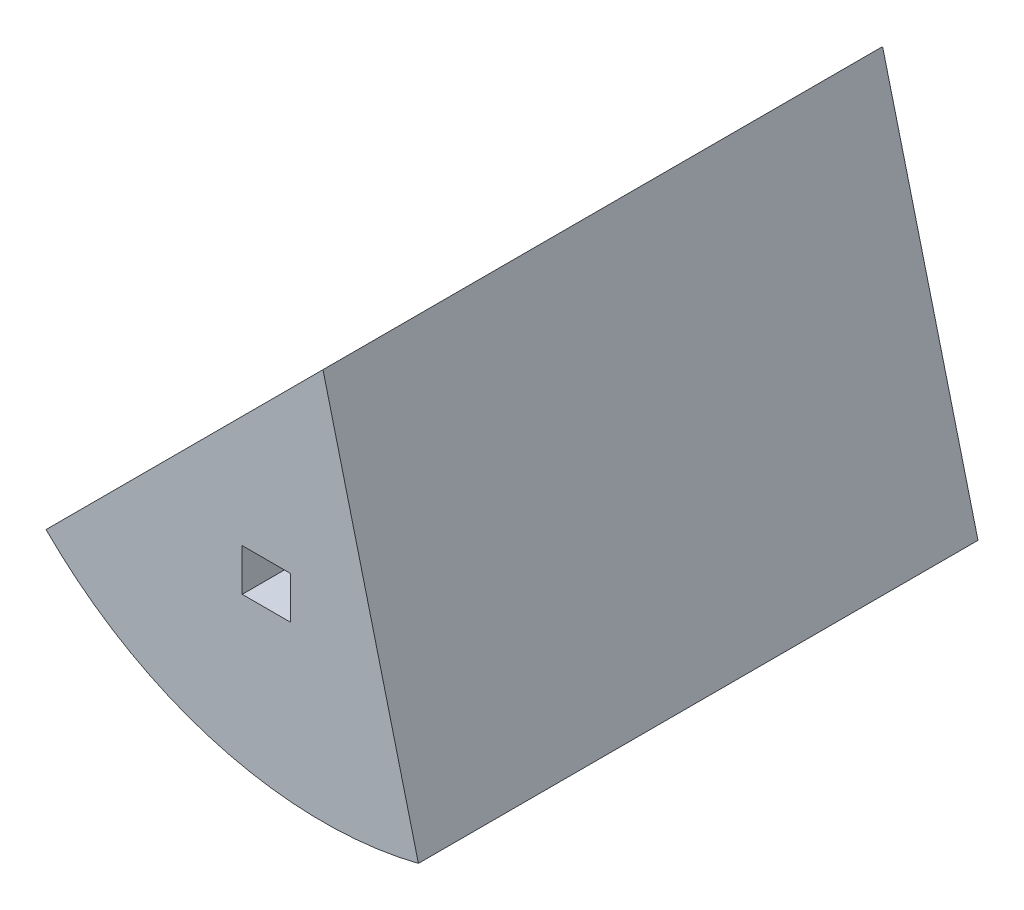
ISO-10303-21;
HEADER;
FILE_DESCRIPTION(('STEP AP214'),'2;1');
FILE_NAME('part.step','',(''),(''),'','','');
FILE_SCHEMA(('AUTOMOTIVE_DESIGN { 1 0 10303 214 1 1 1 1 }'));
ENDSEC;
DATA;
#1=APPLICATION_CONTEXT('core data for automotive mechanical design processes');
#2=APPLICATION_PROTOCOL_DEFINITION('international standard','automotive_design',2000,#1);
#3=PRODUCT_CONTEXT('',#1,'mechanical');
#4=PRODUCT('Part','Part','',(#3));
#5=PRODUCT_RELATED_PRODUCT_CATEGORY('part','',(#4));
#6=PRODUCT_DEFINITION_FORMATION('','',#4);
#7=PRODUCT_DEFINITION_CONTEXT('part definition',#1,'design');
#8=PRODUCT_DEFINITION('design','',#6,#7);
#9=PRODUCT_DEFINITION_SHAPE('','',#8);
#10=(LENGTH_UNIT() NAMED_UNIT(*) SI_UNIT(.MILLI.,.METRE.));
#11=(NAMED_UNIT(*) PLANE_ANGLE_UNIT() SI_UNIT($,.RADIAN.));
#12=(NAMED_UNIT(*) SI_UNIT($,.STERADIAN.) SOLID_ANGLE_UNIT());
#13=UNCERTAINTY_MEASURE_WITH_UNIT(LENGTH_MEASURE(1.E-05),#10,'distance_accuracy_value','');
#14=(GEOMETRIC_REPRESENTATION_CONTEXT(3) GLOBAL_UNCERTAINTY_ASSIGNED_CONTEXT((#13)) GLOBAL_UNIT_ASSIGNED_CONTEXT((#10,
#11,#12)) REPRESENTATION_CONTEXT('',''));
#15=CARTESIAN_POINT('',(0.,0.,0.));
#16=DIRECTION('',(0.,0.,1.));
#17=DIRECTION('',(1.,0.,0.));
#18=AXIS2_PLACEMENT_3D('',#15,#16,#17);
#19=CARTESIAN_POINT('',(0.,0.,50.));
#20=DIRECTION('',(0.,0.,1.));
#21=DIRECTION('',(1.,0.,0.));
#22=AXIS2_PLACEMENT_3D('',#19,#20,#21);
#23=PLANE('',#22);
#24=DIRECTION('',(0.,1.,0.));
#25=VECTOR('',#24,1.);
#26=CARTESIAN_POINT('',(-2.89211557890212,-20.9937215315126,50.));
#27=LINE('',#26,#25);
#28=CARTESIAN_POINT('',(-2.89211557890212,-20.9937215315126,50.));
#29=VERTEX_POINT('',#28);
#30=CARTESIAN_POINT('',(-2.89211557890212,-17.2235406813055,50.));
#31=VERTEX_POINT('',#30);
#32=EDGE_CURVE('E48',#29,#31,#27,.T.);
#33=ORIENTED_EDGE('',*,*,#32,.F.);
#34=DIRECTION('',(1.,0.,0.));
#35=VECTOR('',#34,1.);
#36=CARTESIAN_POINT('',(-7.21647723685237,-20.9937215315126,50.));
#37=LINE('',#36,#35);
#38=CARTESIAN_POINT('',(-7.21647723685237,-20.9937215315126,50.));
#39=VERTEX_POINT('',#38);
#40=EDGE_CURVE('E110',#39,#29,#37,.T.);
#41=ORIENTED_EDGE('',*,*,#40,.F.);
#42=DIRECTION('',(0.,-1.,0.));
#43=VECTOR('',#42,1.);
#44=CARTESIAN_POINT('',(-7.21647723685237,-20.9937215315126,50.));
#45=LINE('',#44,#43);
#46=CARTESIAN_POINT('',(-7.21647723685237,-17.2235406813055,50.));
#47=VERTEX_POINT('',#46);
#48=EDGE_CURVE('E113',#47,#39,#45,.T.);
#49=ORIENTED_EDGE('',*,*,#48,.F.);
#50=DIRECTION('',(-1.,0.,0.));
#51=VECTOR('',#50,1.);
#52=CARTESIAN_POINT('',(-7.21647723685237,-17.2235406813055,50.));
#53=LINE('',#52,#51);
#54=EDGE_CURVE('E119',#31,#47,#53,.T.);
#55=ORIENTED_EDGE('',*,*,#54,.F.);
#56=EDGE_LOOP('',(#33,#41,#49,#55));
#57=FACE_BOUND('',#56,.T.);
#58=DIRECTION('',(-0.243558846598436,0.969886121275915,0.));
#59=VECTOR('',#58,1.);
#60=CARTESIAN_POINT('',(0.,0.,50.));
#61=LINE('',#60,#59);
#62=CARTESIAN_POINT('',(8.52455963094525,-33.946014244657,50.));
#63=VERTEX_POINT('',#62);
#64=CARTESIAN_POINT('',(0.,0.,50.));
#65=VERTEX_POINT('',#64);
#66=EDGE_CURVE('E129',#63,#65,#61,.T.);
#67=ORIENTED_EDGE('',*,*,#66,.T.);
#68=DIRECTION('',(-0.707106781186548,-0.707106781186548,0.));
#69=VECTOR('',#68,1.);
#70=CARTESIAN_POINT('',(0.,0.,50.));
#71=LINE('',#70,#69);
#72=CARTESIAN_POINT('',(-24.7487373415292,-24.7487373415292,50.));
#73=VERTEX_POINT('',#72);
#74=EDGE_CURVE('E132',#65,#73,#71,.T.);
#75=ORIENTED_EDGE('',*,*,#74,.T.);
#76=CARTESIAN_POINT('',(0.,0.,50.));
#77=DIRECTION('',(0.,0.,1.));
#78=DIRECTION('',(1.,0.,0.));
#79=AXIS2_PLACEMENT_3D('',#76,#77,#78);
#80=CIRCLE('',#79,35.);
#81=EDGE_CURVE('E135',#73,#63,#80,.T.);
#82=ORIENTED_EDGE('',*,*,#81,.T.);
#83=EDGE_LOOP('',(#67,#75,#82));
#84=FACE_BOUND('',#83,.T.);
#85=ADVANCED_FACE('F33',(#57,#84),#23,.T.);
#86=CARTESIAN_POINT('',(0.,0.,0.));
#87=DIRECTION('',(0.,0.,1.));
#88=DIRECTION('',(1.,0.,0.));
#89=AXIS2_PLACEMENT_3D('',#86,#87,#88);
#90=PLANE('',#89);
#91=DIRECTION('',(1.,0.,0.));
#92=VECTOR('',#91,1.);
#93=CARTESIAN_POINT('',(-7.21647723685237,-20.9937215315126,0.));
#94=LINE('',#93,#92);
#95=CARTESIAN_POINT('',(-7.21647723685237,-20.9937215315126,0.));
#96=VERTEX_POINT('',#95);
#97=CARTESIAN_POINT('',(-2.89211557890212,-20.9937215315126,0.));
#98=VERTEX_POINT('',#97);
#99=EDGE_CURVE('E100',#96,#98,#94,.T.);
#100=ORIENTED_EDGE('',*,*,#99,.T.);
#101=DIRECTION('',(0.,1.,0.));
#102=VECTOR('',#101,1.);
#103=CARTESIAN_POINT('',(-2.89211557890212,-20.9937215315126,0.));
#104=LINE('',#103,#102);
#105=CARTESIAN_POINT('',(-2.89211557890212,-17.2235406813055,0.));
#106=VERTEX_POINT('',#105);
#107=EDGE_CURVE('E94',#98,#106,#104,.T.);
#108=ORIENTED_EDGE('',*,*,#107,.T.);
#109=DIRECTION('',(-1.,0.,0.));
#110=VECTOR('',#109,1.);
#111=CARTESIAN_POINT('',(-7.21647723685237,-17.2235406813055,0.));
#112=LINE('',#111,#110);
#113=CARTESIAN_POINT('',(-7.21647723685237,-17.2235406813055,0.));
#114=VERTEX_POINT('',#113);
#115=EDGE_CURVE('E103',#106,#114,#112,.T.);
#116=ORIENTED_EDGE('',*,*,#115,.T.);
#117=DIRECTION('',(0.,-1.,0.));
#118=VECTOR('',#117,1.);
#119=CARTESIAN_POINT('',(-7.21647723685237,-20.9937215315126,0.));
#120=LINE('',#119,#118);
#121=EDGE_CURVE('E56',#114,#96,#120,.T.);
#122=ORIENTED_EDGE('',*,*,#121,.T.);
#123=EDGE_LOOP('',(#100,#108,#116,#122));
#124=FACE_BOUND('',#123,.T.);
#125=DIRECTION('',(-0.243558846598436,0.969886121275915,0.));
#126=VECTOR('',#125,1.);
#127=CARTESIAN_POINT('',(0.,0.,0.));
#128=LINE('',#127,#126);
#129=CARTESIAN_POINT('',(8.52455963094525,-33.946014244657,0.));
#130=VERTEX_POINT('',#129);
#131=CARTESIAN_POINT('',(0.,0.,0.));
#132=VERTEX_POINT('',#131);
#133=EDGE_CURVE('E125',#130,#132,#128,.T.);
#134=ORIENTED_EDGE('',*,*,#133,.F.);
#135=CARTESIAN_POINT('',(0.,0.,0.));
#136=DIRECTION('',(0.,0.,1.));
#137=DIRECTION('',(1.,0.,0.));
#138=AXIS2_PLACEMENT_3D('',#135,#136,#137);
#139=CIRCLE('',#138,35.);
#140=CARTESIAN_POINT('',(-24.7487373415292,-24.7487373415292,0.));
#141=VERTEX_POINT('',#140);
#142=EDGE_CURVE('E133',#141,#130,#139,.T.);
#143=ORIENTED_EDGE('',*,*,#142,.F.);
#144=DIRECTION('',(-0.707106781186548,-0.707106781186548,0.));
#145=VECTOR('',#144,1.);
#146=CARTESIAN_POINT('',(0.,0.,0.));
#147=LINE('',#146,#145);
#148=EDGE_CURVE('E140',#132,#141,#147,.T.);
#149=ORIENTED_EDGE('',*,*,#148,.F.);
#150=EDGE_LOOP('',(#134,#143,#149));
#151=FACE_BOUND('',#150,.T.);
#152=ADVANCED_FACE('F107',(#124,#151),#90,.F.);
#153=CARTESIAN_POINT('',(0.,0.,50.));
#154=DIRECTION('',(-0.969886121275915,-0.243558846598436,0.));
#155=DIRECTION('',(0.243558846598436,-0.969886121275915,0.));
#156=AXIS2_PLACEMENT_3D('',#153,#154,#155);
#157=PLANE('',#156);
#158=ORIENTED_EDGE('',*,*,#133,.T.);
#159=DIRECTION('',(0.,0.,-1.));
#160=VECTOR('',#159,1.);
#161=CARTESIAN_POINT('',(0.,0.,50.));
#162=LINE('',#161,#160);
#163=EDGE_CURVE('E11',#65,#132,#162,.T.);
#164=ORIENTED_EDGE('',*,*,#163,.F.);
#165=ORIENTED_EDGE('',*,*,#66,.F.);
#166=DIRECTION('',(0.,0.,-1.));
#167=VECTOR('',#166,1.);
#168=CARTESIAN_POINT('',(8.52455963094525,-33.946014244657,50.));
#169=LINE('',#168,#167);
#170=EDGE_CURVE('E137',#63,#130,#169,.T.);
#171=ORIENTED_EDGE('',*,*,#170,.T.);
#172=EDGE_LOOP('',(#158,#164,#165,#171));
#173=FACE_BOUND('',#172,.T.);
#174=ADVANCED_FACE('F35',(#173),#157,.F.);
#175=CARTESIAN_POINT('',(0.,0.,50.));
#176=DIRECTION('',(0.707106781186548,-0.707106781186548,0.));
#177=DIRECTION('',(0.707106781186548,0.707106781186548,0.));
#178=AXIS2_PLACEMENT_3D('',#175,#176,#177);
#179=PLANE('',#178);
#180=ORIENTED_EDGE('',*,*,#148,.T.);
#181=DIRECTION('',(0.,0.,-1.));
#182=VECTOR('',#181,1.);
#183=CARTESIAN_POINT('',(-24.7487373415292,-24.7487373415292,50.));
#184=LINE('',#183,#182);
#185=EDGE_CURVE('E41',#73,#141,#184,.T.);
#186=ORIENTED_EDGE('',*,*,#185,.F.);
#187=ORIENTED_EDGE('',*,*,#74,.F.);
#188=ORIENTED_EDGE('',*,*,#163,.T.);
#189=EDGE_LOOP('',(#180,#186,#187,#188));
#190=FACE_BOUND('',#189,.T.);
#191=ADVANCED_FACE('F157',(#190),#179,.F.);
#192=CARTESIAN_POINT('',(0.,0.,50.));
#193=DIRECTION('',(0.,0.,-1.));
#194=DIRECTION('',(-1.,0.,0.));
#195=AXIS2_PLACEMENT_3D('',#192,#193,#194);
#196=CYLINDRICAL_SURFACE('',#195,35.);
#197=ORIENTED_EDGE('',*,*,#142,.T.);
#198=ORIENTED_EDGE('',*,*,#170,.F.);
#199=ORIENTED_EDGE('',*,*,#81,.F.);
#200=ORIENTED_EDGE('',*,*,#185,.T.);
#201=EDGE_LOOP('',(#197,#198,#199,#200));
#202=FACE_BOUND('',#201,.T.);
#203=ADVANCED_FACE('F149',(#202),#196,.T.);
#204=CARTESIAN_POINT('',(-2.89211557890212,-20.9937215315126,0.));
#205=DIRECTION('',(1.,0.,0.));
#206=DIRECTION('',(0.,0.,-1.));
#207=AXIS2_PLACEMENT_3D('',#204,#205,#206);
#208=PLANE('',#207);
#209=ORIENTED_EDGE('',*,*,#32,.T.);
#210=DIRECTION('',(0.,0.,1.));
#211=VECTOR('',#210,1.);
#212=CARTESIAN_POINT('',(-2.89211557890212,-17.2235406813055,0.));
#213=LINE('',#212,#211);
#214=EDGE_CURVE('E90',#106,#31,#213,.T.);
#215=ORIENTED_EDGE('',*,*,#214,.F.);
#216=ORIENTED_EDGE('',*,*,#107,.F.);
#217=DIRECTION('',(0.,0.,1.));
#218=VECTOR('',#217,1.);
#219=CARTESIAN_POINT('',(-2.89211557890212,-20.9937215315126,0.));
#220=LINE('',#219,#218);
#221=EDGE_CURVE('E123',#98,#29,#220,.T.);
#222=ORIENTED_EDGE('',*,*,#221,.T.);
#223=EDGE_LOOP('',(#209,#215,#216,#222));
#224=FACE_BOUND('',#223,.T.);
#225=ADVANCED_FACE('F92',(#224),#208,.F.);
#226=CARTESIAN_POINT('',(-7.21647723685237,-20.9937215315126,0.));
#227=DIRECTION('',(0.,-1.,0.));
#228=DIRECTION('',(0.,0.,-1.));
#229=AXIS2_PLACEMENT_3D('',#226,#227,#228);
#230=PLANE('',#229);
#231=ORIENTED_EDGE('',*,*,#40,.T.);
#232=ORIENTED_EDGE('',*,*,#221,.F.);
#233=ORIENTED_EDGE('',*,*,#99,.F.);
#234=DIRECTION('',(0.,0.,1.));
#235=VECTOR('',#234,1.);
#236=CARTESIAN_POINT('',(-7.21647723685237,-20.9937215315126,0.));
#237=LINE('',#236,#235);
#238=EDGE_CURVE('E126',#96,#39,#237,.T.);
#239=ORIENTED_EDGE('',*,*,#238,.T.);
#240=EDGE_LOOP('',(#231,#232,#233,#239));
#241=FACE_BOUND('',#240,.T.);
#242=ADVANCED_FACE('F175',(#241),#230,.F.);
#243=CARTESIAN_POINT('',(-7.21647723685237,-20.9937215315126,0.));
#244=DIRECTION('',(-1.,0.,0.));
#245=DIRECTION('',(0.,0.,1.));
#246=AXIS2_PLACEMENT_3D('',#243,#244,#245);
#247=PLANE('',#246);
#248=ORIENTED_EDGE('',*,*,#48,.T.);
#249=ORIENTED_EDGE('',*,*,#238,.F.);
#250=ORIENTED_EDGE('',*,*,#121,.F.);
#251=DIRECTION('',(0.,0.,1.));
#252=VECTOR('',#251,1.);
#253=CARTESIAN_POINT('',(-7.21647723685237,-17.2235406813055,0.));
#254=LINE('',#253,#252);
#255=EDGE_CURVE('E99',#114,#47,#254,.T.);
#256=ORIENTED_EDGE('',*,*,#255,.T.);
#257=EDGE_LOOP('',(#248,#249,#250,#256));
#258=FACE_BOUND('',#257,.T.);
#259=ADVANCED_FACE('F178',(#258),#247,.F.);
#260=CARTESIAN_POINT('',(-7.21647723685237,-17.2235406813055,0.));
#261=DIRECTION('',(0.,1.,0.));
#262=DIRECTION('',(0.,0.,1.));
#263=AXIS2_PLACEMENT_3D('',#260,#261,#262);
#264=PLANE('',#263);
#265=ORIENTED_EDGE('',*,*,#54,.T.);
#266=ORIENTED_EDGE('',*,*,#255,.F.);
#267=ORIENTED_EDGE('',*,*,#115,.F.);
#268=ORIENTED_EDGE('',*,*,#214,.T.);
#269=EDGE_LOOP('',(#265,#266,#267,#268));
#270=FACE_BOUND('',#269,.T.);
#271=ADVANCED_FACE('F104',(#270),#264,.F.);
#272=CLOSED_SHELL('',(#85,#152,#174,#191,#203,#225,#242,#259,#271));
#273=MANIFOLD_SOLID_BREP('B2',#272);
#274=ADVANCED_BREP_SHAPE_REPRESENTATION('',(#18,#273),#14);
#275=SHAPE_DEFINITION_REPRESENTATION(#9,#274);
ENDSEC;
END-ISO-10303-21;
